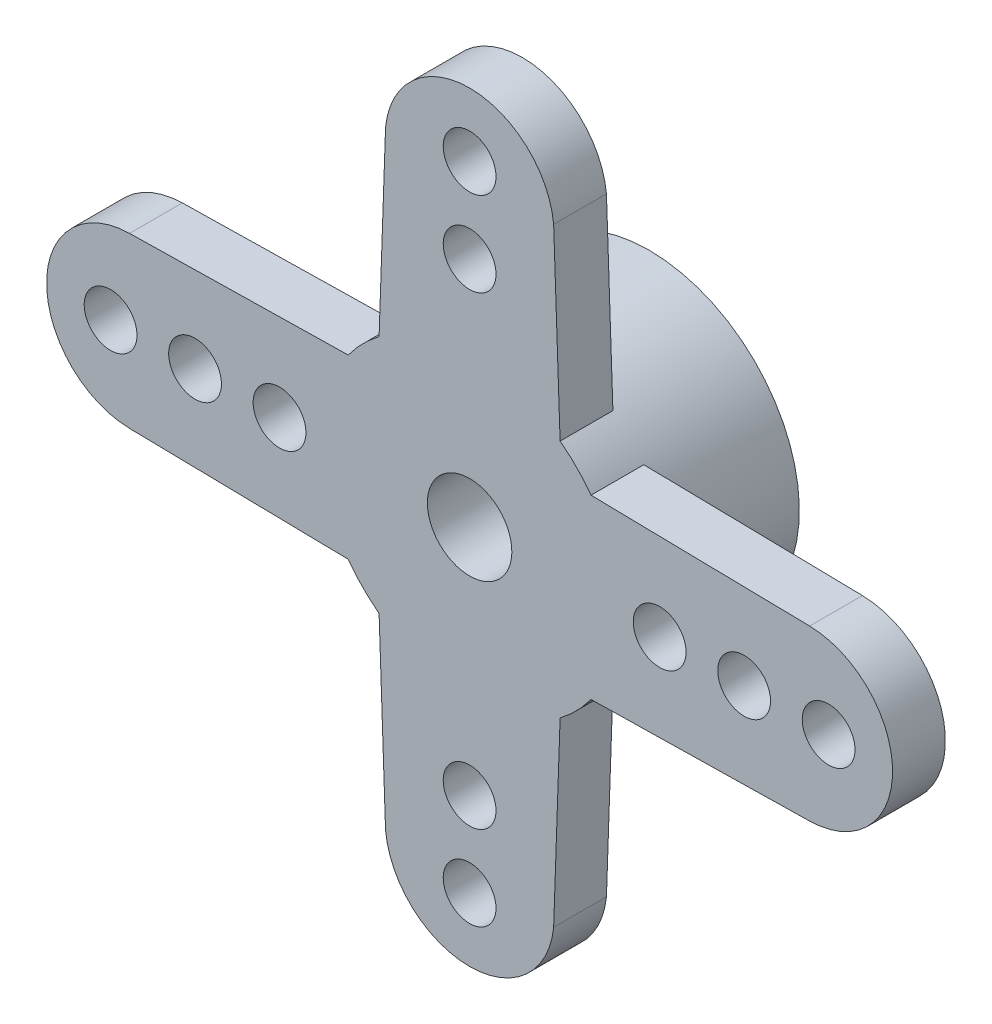
ISO-10303-21;
HEADER;
FILE_DESCRIPTION(('STEP AP214'),'2;1');
FILE_NAME('part.step','',(''),(''),'','','');
FILE_SCHEMA(('AUTOMOTIVE_DESIGN { 1 0 10303 214 1 1 1 1 }'));
ENDSEC;
DATA;
#1=APPLICATION_CONTEXT('core data for automotive mechanical design processes');
#2=APPLICATION_PROTOCOL_DEFINITION('international standard','automotive_design',2000,#1);
#3=PRODUCT_CONTEXT('',#1,'mechanical');
#4=PRODUCT('Part','Part','',(#3));
#5=PRODUCT_RELATED_PRODUCT_CATEGORY('part','',(#4));
#6=PRODUCT_DEFINITION_FORMATION('','',#4);
#7=PRODUCT_DEFINITION_CONTEXT('part definition',#1,'design');
#8=PRODUCT_DEFINITION('design','',#6,#7);
#9=PRODUCT_DEFINITION_SHAPE('','',#8);
#10=(LENGTH_UNIT() NAMED_UNIT(*) SI_UNIT(.MILLI.,.METRE.));
#11=(NAMED_UNIT(*) PLANE_ANGLE_UNIT() SI_UNIT($,.RADIAN.));
#12=(NAMED_UNIT(*) SI_UNIT($,.STERADIAN.) SOLID_ANGLE_UNIT());
#13=UNCERTAINTY_MEASURE_WITH_UNIT(LENGTH_MEASURE(1.E-05),#10,'distance_accuracy_value','');
#14=(GEOMETRIC_REPRESENTATION_CONTEXT(3) GLOBAL_UNCERTAINTY_ASSIGNED_CONTEXT((#13)) GLOBAL_UNIT_ASSIGNED_CONTEXT((#10,
#11,#12)) REPRESENTATION_CONTEXT('',''));
#15=CARTESIAN_POINT('',(0.,0.,0.));
#16=DIRECTION('',(0.,0.,1.));
#17=DIRECTION('',(1.,0.,0.));
#18=AXIS2_PLACEMENT_3D('',#15,#16,#17);
#19=CARTESIAN_POINT('',(0.,0.,24.596));
#20=DIRECTION('',(0.,0.,1.));
#21=DIRECTION('',(1.,0.,0.));
#22=AXIS2_PLACEMENT_3D('',#19,#20,#21);
#23=PLANE('',#22);
#24=CARTESIAN_POINT('',(0.,0.,24.596));
#25=DIRECTION('',(0.,0.,-1.));
#26=DIRECTION('',(0.,-1.,0.));
#27=AXIS2_PLACEMENT_3D('',#24,#25,#26);
#28=CIRCLE('',#27,1.);
#29=CARTESIAN_POINT('',(0.,1.,24.596));
#30=VERTEX_POINT('',#29);
#31=EDGE_CURVE('E393',#30,#30,#28,.T.);
#32=ORIENTED_EDGE('',*,*,#31,.F.);
#33=EDGE_LOOP('',(#32));
#34=FACE_BOUND('',#33,.T.);
#35=CARTESIAN_POINT('',(0.,0.,24.596));
#36=DIRECTION('',(0.,0.,1.));
#37=DIRECTION('',(0.,-1.,0.));
#38=AXIS2_PLACEMENT_3D('',#35,#36,#37);
#39=CIRCLE('',#38,3.55627483864503);
#40=CARTESIAN_POINT('',(0.,3.55627483864503,24.596));
#41=VERTEX_POINT('',#40);
#42=EDGE_CURVE('E11',#41,#41,#39,.T.);
#43=ORIENTED_EDGE('',*,*,#42,.F.);
#44=EDGE_LOOP('',(#43));
#45=FACE_BOUND('',#44,.T.);
#46=ADVANCED_FACE('F19',(#34,#45),#23,.F.);
#47=CARTESIAN_POINT('',(0.,0.,24.596));
#48=DIRECTION('',(0.,0.,1.));
#49=DIRECTION('',(0.,-1.,0.));
#50=AXIS2_PLACEMENT_3D('',#47,#48,#49);
#51=CYLINDRICAL_SURFACE('',#50,3.55627483864503);
#52=CARTESIAN_POINT('',(0.,0.,27.596));
#53=DIRECTION('',(0.,0.,1.));
#54=DIRECTION('',(0.,-1.,0.));
#55=AXIS2_PLACEMENT_3D('',#52,#53,#54);
#56=CIRCLE('',#55,3.55627483864503);
#57=CARTESIAN_POINT('',(2.14292282721414,2.83812834180985,27.596));
#58=VERTEX_POINT('',#57);
#59=CARTESIAN_POINT('',(0.,3.55627483864503,27.596));
#60=VERTEX_POINT('',#59);
#61=EDGE_CURVE('E413',#58,#60,#56,.T.);
#62=ORIENTED_EDGE('',*,*,#61,.F.);
#63=DIRECTION('',(0.,0.,1.));
#64=VECTOR('',#63,1.);
#65=CARTESIAN_POINT('',(2.14292282721414,2.83812834180985,27.596));
#66=LINE('',#65,#64);
#67=CARTESIAN_POINT('',(2.14292282721414,2.83812834180985,28.846));
#68=VERTEX_POINT('',#67);
#69=EDGE_CURVE('E338',#58,#68,#66,.T.);
#70=ORIENTED_EDGE('',*,*,#69,.T.);
#71=CARTESIAN_POINT('',(0.,0.,28.846));
#72=DIRECTION('',(0.,0.,1.));
#73=DIRECTION('',(0.,1.,0.));
#74=AXIS2_PLACEMENT_3D('',#71,#72,#73);
#75=CIRCLE('',#74,3.55627483864503);
#76=CARTESIAN_POINT('',(2.87430140217952,2.09415428691599,28.846));
#77=VERTEX_POINT('',#76);
#78=EDGE_CURVE('E285',#77,#68,#75,.T.);
#79=ORIENTED_EDGE('',*,*,#78,.F.);
#80=DIRECTION('',(0.,0.,1.));
#81=VECTOR('',#80,1.);
#82=CARTESIAN_POINT('',(2.87430140217952,2.09415428691599,27.596));
#83=LINE('',#82,#81);
#84=CARTESIAN_POINT('',(2.87430140217952,2.09415428691599,27.596));
#85=VERTEX_POINT('',#84);
#86=EDGE_CURVE('E333',#85,#77,#83,.T.);
#87=ORIENTED_EDGE('',*,*,#86,.F.);
#88=CARTESIAN_POINT('',(0.,0.,27.596));
#89=DIRECTION('',(0.,0.,1.));
#90=DIRECTION('',(0.,-1.,0.));
#91=AXIS2_PLACEMENT_3D('',#88,#89,#90);
#92=CIRCLE('',#91,3.55627483864503);
#93=CARTESIAN_POINT('',(2.87430140217952,-2.09415428691599,27.596));
#94=VERTEX_POINT('',#93);
#95=EDGE_CURVE('E303',#94,#85,#92,.T.);
#96=ORIENTED_EDGE('',*,*,#95,.F.);
#97=DIRECTION('',(0.,0.,1.));
#98=VECTOR('',#97,1.);
#99=CARTESIAN_POINT('',(2.87430140217952,-2.09415428691599,27.596));
#100=LINE('',#99,#98);
#101=CARTESIAN_POINT('',(2.87430140217952,-2.09415428691599,28.846));
#102=VERTEX_POINT('',#101);
#103=EDGE_CURVE('E531',#94,#102,#100,.T.);
#104=ORIENTED_EDGE('',*,*,#103,.T.);
#105=CARTESIAN_POINT('',(0.,0.,28.846));
#106=DIRECTION('',(0.,0.,1.));
#107=DIRECTION('',(0.,1.,0.));
#108=AXIS2_PLACEMENT_3D('',#105,#106,#107);
#109=CIRCLE('',#108,3.55627483864503);
#110=CARTESIAN_POINT('',(2.14292282721414,-2.83812834180985,28.846));
#111=VERTEX_POINT('',#110);
#112=EDGE_CURVE('E385',#111,#102,#109,.T.);
#113=ORIENTED_EDGE('',*,*,#112,.F.);
#114=DIRECTION('',(0.,0.,1.));
#115=VECTOR('',#114,1.);
#116=CARTESIAN_POINT('',(2.14292282721414,-2.83812834180985,27.596));
#117=LINE('',#116,#115);
#118=CARTESIAN_POINT('',(2.14292282721414,-2.83812834180985,27.596));
#119=VERTEX_POINT('',#118);
#120=EDGE_CURVE('E321',#119,#111,#117,.T.);
#121=ORIENTED_EDGE('',*,*,#120,.F.);
#122=CARTESIAN_POINT('',(0.,0.,27.596));
#123=DIRECTION('',(0.,0.,1.));
#124=DIRECTION('',(0.,-1.,0.));
#125=AXIS2_PLACEMENT_3D('',#122,#123,#124);
#126=CIRCLE('',#125,3.55627483864503);
#127=CARTESIAN_POINT('',(-2.14292282721414,-2.83812834180985,27.596));
#128=VERTEX_POINT('',#127);
#129=EDGE_CURVE('E304',#128,#119,#126,.T.);
#130=ORIENTED_EDGE('',*,*,#129,.F.);
#131=DIRECTION('',(0.,0.,1.));
#132=VECTOR('',#131,1.);
#133=CARTESIAN_POINT('',(-2.14292282721414,-2.83812834180985,27.596));
#134=LINE('',#133,#132);
#135=CARTESIAN_POINT('',(-2.14292282721414,-2.83812834180985,28.846));
#136=VERTEX_POINT('',#135);
#137=EDGE_CURVE('E465',#128,#136,#134,.T.);
#138=ORIENTED_EDGE('',*,*,#137,.T.);
#139=CARTESIAN_POINT('',(0.,0.,28.846));
#140=DIRECTION('',(0.,0.,1.));
#141=DIRECTION('',(0.,1.,0.));
#142=AXIS2_PLACEMENT_3D('',#139,#140,#141);
#143=CIRCLE('',#142,3.55627483864503);
#144=CARTESIAN_POINT('',(-2.87430140217952,-2.09415428691599,28.846));
#145=VERTEX_POINT('',#144);
#146=EDGE_CURVE('E251',#145,#136,#143,.T.);
#147=ORIENTED_EDGE('',*,*,#146,.F.);
#148=DIRECTION('',(0.,0.,1.));
#149=VECTOR('',#148,1.);
#150=CARTESIAN_POINT('',(-2.87430140217952,-2.09415428691599,27.596));
#151=LINE('',#150,#149);
#152=CARTESIAN_POINT('',(-2.87430140217952,-2.09415428691599,27.596));
#153=VERTEX_POINT('',#152);
#154=EDGE_CURVE('E342',#153,#145,#151,.T.);
#155=ORIENTED_EDGE('',*,*,#154,.F.);
#156=CARTESIAN_POINT('',(0.,0.,27.596));
#157=DIRECTION('',(0.,0.,1.));
#158=DIRECTION('',(0.,-1.,0.));
#159=AXIS2_PLACEMENT_3D('',#156,#157,#158);
#160=CIRCLE('',#159,3.55627483864503);
#161=CARTESIAN_POINT('',(-2.87430140217952,2.09415428691599,27.596));
#162=VERTEX_POINT('',#161);
#163=EDGE_CURVE('E258',#162,#153,#160,.T.);
#164=ORIENTED_EDGE('',*,*,#163,.F.);
#165=DIRECTION('',(0.,0.,1.));
#166=VECTOR('',#165,1.);
#167=CARTESIAN_POINT('',(-2.87430140217952,2.09415428691599,27.596));
#168=LINE('',#167,#166);
#169=CARTESIAN_POINT('',(-2.87430140217952,2.09415428691599,28.846));
#170=VERTEX_POINT('',#169);
#171=EDGE_CURVE('E254',#162,#170,#168,.T.);
#172=ORIENTED_EDGE('',*,*,#171,.T.);
#173=CARTESIAN_POINT('',(0.,0.,28.846));
#174=DIRECTION('',(0.,0.,1.));
#175=DIRECTION('',(0.,1.,0.));
#176=AXIS2_PLACEMENT_3D('',#173,#174,#175);
#177=CIRCLE('',#176,3.55627483864503);
#178=CARTESIAN_POINT('',(-2.14292282721414,2.83812834180985,28.846));
#179=VERTEX_POINT('',#178);
#180=EDGE_CURVE('E241',#179,#170,#177,.T.);
#181=ORIENTED_EDGE('',*,*,#180,.F.);
#182=DIRECTION('',(0.,0.,1.));
#183=VECTOR('',#182,1.);
#184=CARTESIAN_POINT('',(-2.14292282721414,2.83812834180985,27.596));
#185=LINE('',#184,#183);
#186=CARTESIAN_POINT('',(-2.14292282721414,2.83812834180985,27.596));
#187=VERTEX_POINT('',#186);
#188=EDGE_CURVE('E263',#187,#179,#185,.T.);
#189=ORIENTED_EDGE('',*,*,#188,.F.);
#190=CARTESIAN_POINT('',(0.,0.,27.596));
#191=DIRECTION('',(0.,0.,1.));
#192=DIRECTION('',(0.,-1.,0.));
#193=AXIS2_PLACEMENT_3D('',#190,#191,#192);
#194=CIRCLE('',#193,3.55627483864503);
#195=EDGE_CURVE('E23',#60,#187,#194,.T.);
#196=ORIENTED_EDGE('',*,*,#195,.F.);
#197=DIRECTION('',(0.,0.,-1.));
#198=VECTOR('',#197,1.);
#199=CARTESIAN_POINT('',(0.,3.55627483864503,24.596));
#200=LINE('',#199,#198);
#201=EDGE_CURVE('E30',#60,#41,#200,.T.);
#202=ORIENTED_EDGE('',*,*,#201,.T.);
#203=ORIENTED_EDGE('',*,*,#42,.T.);
#204=ORIENTED_EDGE('',*,*,#201,.F.);
#205=EDGE_LOOP('',(#62,#70,#79,#87,#96,#104,#113,#121,#130,#138,#147,#155,#164,#172,#181,#189,
#196,#202,#203,#204));
#206=FACE_BOUND('',#205,.T.);
#207=ADVANCED_FACE('F256',(#206),#51,.T.);
#208=CARTESIAN_POINT('',(0.,0.,24.596));
#209=DIRECTION('',(0.,0.,1.));
#210=DIRECTION('',(0.,-1.,0.));
#211=AXIS2_PLACEMENT_3D('',#208,#209,#210);
#212=CYLINDRICAL_SURFACE('',#211,1.);
#213=CARTESIAN_POINT('',(0.,0.,28.846));
#214=DIRECTION('',(0.,0.,-1.));
#215=DIRECTION('',(0.,1.,0.));
#216=AXIS2_PLACEMENT_3D('',#213,#214,#215);
#217=CIRCLE('',#216,1.);
#218=CARTESIAN_POINT('',(0.,1.,28.846));
#219=VERTEX_POINT('',#218);
#220=EDGE_CURVE('E280',#219,#219,#217,.T.);
#221=ORIENTED_EDGE('',*,*,#220,.F.);
#222=DIRECTION('',(0.,0.,-1.));
#223=VECTOR('',#222,1.);
#224=CARTESIAN_POINT('',(0.,1.,24.596));
#225=LINE('',#224,#223);
#226=EDGE_CURVE('E284',#219,#30,#225,.T.);
#227=ORIENTED_EDGE('',*,*,#226,.T.);
#228=ORIENTED_EDGE('',*,*,#31,.T.);
#229=ORIENTED_EDGE('',*,*,#226,.F.);
#230=EDGE_LOOP('',(#221,#227,#228,#229));
#231=FACE_BOUND('',#230,.T.);
#232=ADVANCED_FACE('F636',(#231),#212,.F.);
#233=CARTESIAN_POINT('',(0.,0.,28.846));
#234=DIRECTION('',(0.,0.,1.));
#235=DIRECTION('',(1.,0.,0.));
#236=AXIS2_PLACEMENT_3D('',#233,#234,#235);
#237=PLANE('',#236);
#238=CARTESIAN_POINT('',(6.5,0.,28.846));
#239=DIRECTION('',(0.,0.,-1.));
#240=DIRECTION('',(0.,1.,0.));
#241=AXIS2_PLACEMENT_3D('',#238,#239,#240);
#242=CIRCLE('',#241,0.625);
#243=CARTESIAN_POINT('',(6.5,-0.625,28.846));
#244=VERTEX_POINT('',#243);
#245=EDGE_CURVE('E477',#244,#244,#242,.T.);
#246=ORIENTED_EDGE('',*,*,#245,.T.);
#247=EDGE_LOOP('',(#246));
#248=FACE_BOUND('',#247,.T.);
#249=CARTESIAN_POINT('',(0.,5.5,28.846));
#250=DIRECTION('',(0.,0.,-1.));
#251=DIRECTION('',(0.,1.,0.));
#252=AXIS2_PLACEMENT_3D('',#249,#250,#251);
#253=CIRCLE('',#252,0.625);
#254=CARTESIAN_POINT('',(0.,4.875,28.846));
#255=VERTEX_POINT('',#254);
#256=EDGE_CURVE('E406',#255,#255,#253,.T.);
#257=ORIENTED_EDGE('',*,*,#256,.T.);
#258=EDGE_LOOP('',(#257));
#259=FACE_BOUND('',#258,.T.);
#260=CARTESIAN_POINT('',(0.,7.5,28.846));
#261=DIRECTION('',(0.,0.,-1.));
#262=DIRECTION('',(0.,1.,0.));
#263=AXIS2_PLACEMENT_3D('',#260,#261,#262);
#264=CIRCLE('',#263,0.625);
#265=CARTESIAN_POINT('',(0.,6.875,28.846));
#266=VERTEX_POINT('',#265);
#267=EDGE_CURVE('E379',#266,#266,#264,.T.);
#268=ORIENTED_EDGE('',*,*,#267,.T.);
#269=EDGE_LOOP('',(#268));
#270=FACE_BOUND('',#269,.T.);
#271=CARTESIAN_POINT('',(-4.5,0.,28.846));
#272=DIRECTION('',(0.,0.,-1.));
#273=DIRECTION('',(0.,1.,0.));
#274=AXIS2_PLACEMENT_3D('',#271,#272,#273);
#275=CIRCLE('',#274,0.625);
#276=CARTESIAN_POINT('',(-4.5,-0.625,28.846));
#277=VERTEX_POINT('',#276);
#278=EDGE_CURVE('E378',#277,#277,#275,.T.);
#279=ORIENTED_EDGE('',*,*,#278,.T.);
#280=EDGE_LOOP('',(#279));
#281=FACE_BOUND('',#280,.T.);
#282=CARTESIAN_POINT('',(4.5,0.,28.846));
#283=DIRECTION('',(0.,0.,-1.));
#284=DIRECTION('',(0.,1.,0.));
#285=AXIS2_PLACEMENT_3D('',#282,#283,#284);
#286=CIRCLE('',#285,0.625);
#287=CARTESIAN_POINT('',(4.5,-0.625,28.846));
#288=VERTEX_POINT('',#287);
#289=EDGE_CURVE('E459',#288,#288,#286,.T.);
#290=ORIENTED_EDGE('',*,*,#289,.T.);
#291=EDGE_LOOP('',(#290));
#292=FACE_BOUND('',#291,.T.);
#293=CARTESIAN_POINT('',(8.5,0.,28.846));
#294=DIRECTION('',(0.,0.,-1.));
#295=DIRECTION('',(0.,1.,0.));
#296=AXIS2_PLACEMENT_3D('',#293,#294,#295);
#297=CIRCLE('',#296,0.625);
#298=CARTESIAN_POINT('',(8.5,-0.625,28.846));
#299=VERTEX_POINT('',#298);
#300=EDGE_CURVE('E424',#299,#299,#297,.T.);
#301=ORIENTED_EDGE('',*,*,#300,.T.);
#302=EDGE_LOOP('',(#301));
#303=FACE_BOUND('',#302,.T.);
#304=CARTESIAN_POINT('',(0.,-5.5,28.846));
#305=DIRECTION('',(0.,0.,-1.));
#306=DIRECTION('',(0.,1.,0.));
#307=AXIS2_PLACEMENT_3D('',#304,#305,#306);
#308=CIRCLE('',#307,0.625);
#309=CARTESIAN_POINT('',(0.,-6.125,28.846));
#310=VERTEX_POINT('',#309);
#311=EDGE_CURVE('E380',#310,#310,#308,.T.);
#312=ORIENTED_EDGE('',*,*,#311,.T.);
#313=EDGE_LOOP('',(#312));
#314=FACE_BOUND('',#313,.T.);
#315=CARTESIAN_POINT('',(-6.5,0.,28.846));
#316=DIRECTION('',(0.,0.,-1.));
#317=DIRECTION('',(0.,1.,0.));
#318=AXIS2_PLACEMENT_3D('',#315,#316,#317);
#319=CIRCLE('',#318,0.625);
#320=CARTESIAN_POINT('',(-6.5,-0.625,28.846));
#321=VERTEX_POINT('',#320);
#322=EDGE_CURVE('E364',#321,#321,#319,.T.);
#323=ORIENTED_EDGE('',*,*,#322,.T.);
#324=EDGE_LOOP('',(#323));
#325=FACE_BOUND('',#324,.T.);
#326=CARTESIAN_POINT('',(0.,-7.5,28.846));
#327=DIRECTION('',(0.,0.,-1.));
#328=DIRECTION('',(0.,1.,0.));
#329=AXIS2_PLACEMENT_3D('',#326,#327,#328);
#330=CIRCLE('',#329,0.625);
#331=CARTESIAN_POINT('',(0.,-8.125,28.846));
#332=VERTEX_POINT('',#331);
#333=EDGE_CURVE('E343',#332,#332,#330,.T.);
#334=ORIENTED_EDGE('',*,*,#333,.T.);
#335=EDGE_LOOP('',(#334));
#336=FACE_BOUND('',#335,.T.);
#337=ORIENTED_EDGE('',*,*,#220,.T.);
#338=EDGE_LOOP('',(#337));
#339=FACE_BOUND('',#338,.T.);
#340=CARTESIAN_POINT('',(-8.5,0.,28.846));
#341=DIRECTION('',(0.,0.,-1.));
#342=DIRECTION('',(0.,1.,0.));
#343=AXIS2_PLACEMENT_3D('',#340,#341,#342);
#344=CIRCLE('',#343,0.625);
#345=CARTESIAN_POINT('',(-8.5,-0.625,28.846));
#346=VERTEX_POINT('',#345);
#347=EDGE_CURVE('E315',#346,#346,#344,.T.);
#348=ORIENTED_EDGE('',*,*,#347,.T.);
#349=EDGE_LOOP('',(#348));
#350=FACE_BOUND('',#349,.T.);
#351=DIRECTION('',(-0.0349866263033822,-0.999387780583647,0.));
#352=VECTOR('',#351,1.);
#353=CARTESIAN_POINT('',(-1.98997962611515,7.20692815052137,28.846));
#354=LINE('',#353,#352);
#355=CARTESIAN_POINT('',(-1.98997962611515,7.20692815052137,28.846));
#356=VERTEX_POINT('',#355);
#357=EDGE_CURVE('E248',#356,#179,#354,.T.);
#358=ORIENTED_EDGE('',*,*,#357,.T.);
#359=ORIENTED_EDGE('',*,*,#180,.T.);
#360=DIRECTION('',(-0.999833462443695,-0.0182495856898571,0.));
#361=VECTOR('',#360,1.);
#362=CARTESIAN_POINT('',(-8.05094639235769,1.99966692488739,28.846));
#363=LINE('',#362,#361);
#364=CARTESIAN_POINT('',(-8.05094639235769,1.99966692488739,28.846));
#365=VERTEX_POINT('',#364);
#366=EDGE_CURVE('E245',#170,#365,#363,.T.);
#367=ORIENTED_EDGE('',*,*,#366,.T.);
#368=CARTESIAN_POINT('',(-8.01444722097798,0.,28.846));
#369=DIRECTION('',(0.,0.,1.));
#370=DIRECTION('',(0.,1.,0.));
#371=AXIS2_PLACEMENT_3D('',#368,#369,#370);
#372=CIRCLE('',#371,2.);
#373=CARTESIAN_POINT('',(-8.05094639235769,-1.99966692488739,28.846));
#374=VERTEX_POINT('',#373);
#375=EDGE_CURVE('E274',#365,#374,#372,.T.);
#376=ORIENTED_EDGE('',*,*,#375,.T.);
#377=DIRECTION('',(0.999833462443695,-0.0182495856898576,0.));
#378=VECTOR('',#377,1.);
#379=CARTESIAN_POINT('',(-8.05094639235769,-1.99966692488739,28.846));
#380=LINE('',#379,#378);
#381=EDGE_CURVE('E331',#374,#145,#380,.T.);
#382=ORIENTED_EDGE('',*,*,#381,.T.);
#383=ORIENTED_EDGE('',*,*,#146,.T.);
#384=DIRECTION('',(0.0349866263033817,-0.999387780583647,0.));
#385=VECTOR('',#384,1.);
#386=CARTESIAN_POINT('',(-1.98997962611515,-7.20692815052137,28.846));
#387=LINE('',#386,#385);
#388=CARTESIAN_POINT('',(-1.98997962611516,-7.20692815052137,28.846));
#389=VERTEX_POINT('',#388);
#390=EDGE_CURVE('E278',#136,#389,#387,.T.);
#391=ORIENTED_EDGE('',*,*,#390,.T.);
#392=CARTESIAN_POINT('',(0.,-7.00697543699491,28.846));
#393=DIRECTION('',(0.,0.,1.));
#394=DIRECTION('',(0.,1.,0.));
#395=AXIS2_PLACEMENT_3D('',#392,#393,#394);
#396=CIRCLE('',#395,2.);
#397=CARTESIAN_POINT('',(1.98997962611515,-7.20692815052137,28.846));
#398=VERTEX_POINT('',#397);
#399=EDGE_CURVE('E428',#389,#398,#396,.T.);
#400=ORIENTED_EDGE('',*,*,#399,.T.);
#401=DIRECTION('',(0.0349866263033821,0.999387780583647,0.));
#402=VECTOR('',#401,1.);
#403=CARTESIAN_POINT('',(1.98997962611515,-7.20692815052137,28.846));
#404=LINE('',#403,#402);
#405=EDGE_CURVE('E316',#398,#111,#404,.T.);
#406=ORIENTED_EDGE('',*,*,#405,.T.);
#407=ORIENTED_EDGE('',*,*,#112,.T.);
#408=DIRECTION('',(0.999833462443695,0.018249585689857,0.));
#409=VECTOR('',#408,1.);
#410=CARTESIAN_POINT('',(8.05094639235769,-1.99966692488739,28.846));
#411=LINE('',#410,#409);
#412=CARTESIAN_POINT('',(8.05094639235769,-1.99966692488739,28.846));
#413=VERTEX_POINT('',#412);
#414=EDGE_CURVE('E326',#102,#413,#411,.T.);
#415=ORIENTED_EDGE('',*,*,#414,.T.);
#416=CARTESIAN_POINT('',(8.01444722097798,0.,28.846));
#417=DIRECTION('',(0.,0.,1.));
#418=DIRECTION('',(0.,1.,0.));
#419=AXIS2_PLACEMENT_3D('',#416,#417,#418);
#420=CIRCLE('',#419,2.);
#421=CARTESIAN_POINT('',(8.05094639235769,1.99966692488739,28.846));
#422=VERTEX_POINT('',#421);
#423=EDGE_CURVE('E327',#413,#422,#420,.T.);
#424=ORIENTED_EDGE('',*,*,#423,.T.);
#425=DIRECTION('',(-0.999833462443695,0.0182495856898577,0.));
#426=VECTOR('',#425,1.);
#427=CARTESIAN_POINT('',(8.05094639235769,1.99966692488739,28.846));
#428=LINE('',#427,#426);
#429=EDGE_CURVE('E337',#422,#77,#428,.T.);
#430=ORIENTED_EDGE('',*,*,#429,.T.);
#431=ORIENTED_EDGE('',*,*,#78,.T.);
#432=DIRECTION('',(-0.0349866263033815,0.999387780583647,0.));
#433=VECTOR('',#432,1.);
#434=CARTESIAN_POINT('',(1.98997962611516,7.20692815052137,28.846));
#435=LINE('',#434,#433);
#436=CARTESIAN_POINT('',(1.98997962611516,7.20692815052137,28.846));
#437=VERTEX_POINT('',#436);
#438=EDGE_CURVE('E356',#68,#437,#435,.T.);
#439=ORIENTED_EDGE('',*,*,#438,.T.);
#440=CARTESIAN_POINT('',(0.,7.00697543699491,28.846));
#441=DIRECTION('',(0.,0.,1.));
#442=DIRECTION('',(0.,1.,0.));
#443=AXIS2_PLACEMENT_3D('',#440,#441,#442);
#444=CIRCLE('',#443,2.);
#445=EDGE_CURVE('E357',#437,#356,#444,.T.);
#446=ORIENTED_EDGE('',*,*,#445,.T.);
#447=EDGE_LOOP('',(#358,#359,#367,#376,#382,#383,#391,#400,#406,#407,#415,#424,#430,#431,#439,#446));
#448=FACE_BOUND('',#447,.T.);
#449=ADVANCED_FACE('F243',(#248,#259,#270,#281,#292,#303,#314,#325,#336,#339,#350,#448),#237,.T.);
#450=CARTESIAN_POINT('',(-1.98997962611515,7.20692815052137,27.596));
#451=DIRECTION('',(-0.999387780583647,0.0349866263033822,0.));
#452=DIRECTION('',(0.,0.,1.));
#453=AXIS2_PLACEMENT_3D('',#450,#451,#452);
#454=PLANE('',#453);
#455=DIRECTION('',(-0.0349866263033822,-0.999387780583647,0.));
#456=VECTOR('',#455,1.);
#457=CARTESIAN_POINT('',(-1.98997962611515,7.20692815052137,27.596));
#458=LINE('',#457,#456);
#459=CARTESIAN_POINT('',(-1.98997962611515,7.20692815052137,27.596));
#460=VERTEX_POINT('',#459);
#461=EDGE_CURVE('E291',#460,#187,#458,.T.);
#462=ORIENTED_EDGE('',*,*,#461,.T.);
#463=ORIENTED_EDGE('',*,*,#188,.T.);
#464=ORIENTED_EDGE('',*,*,#357,.F.);
#465=DIRECTION('',(0.,0.,1.));
#466=VECTOR('',#465,1.);
#467=CARTESIAN_POINT('',(-1.98997962611515,7.20692815052137,27.596));
#468=LINE('',#467,#466);
#469=EDGE_CURVE('E314',#460,#356,#468,.T.);
#470=ORIENTED_EDGE('',*,*,#469,.F.);
#471=EDGE_LOOP('',(#462,#463,#464,#470));
#472=FACE_BOUND('',#471,.T.);
#473=ADVANCED_FACE('F646',(#472),#454,.T.);
#474=CARTESIAN_POINT('',(-2.87430140217952,2.09415428691599,27.596));
#475=DIRECTION('',(-0.0182495856898571,0.999833462443695,0.));
#476=DIRECTION('',(0.,0.,1.));
#477=AXIS2_PLACEMENT_3D('',#474,#475,#476);
#478=PLANE('',#477);
#479=DIRECTION('',(0.999833462443695,0.0182495856898571,0.));
#480=VECTOR('',#479,1.);
#481=CARTESIAN_POINT('',(-8.05094639235769,1.99966692488739,27.596));
#482=LINE('',#481,#480);
#483=CARTESIAN_POINT('',(-8.05094639235769,1.99966692488739,27.596));
#484=VERTEX_POINT('',#483);
#485=EDGE_CURVE('E402',#484,#162,#482,.T.);
#486=ORIENTED_EDGE('',*,*,#485,.F.);
#487=DIRECTION('',(0.,0.,1.));
#488=VECTOR('',#487,1.);
#489=CARTESIAN_POINT('',(-8.05094639235769,1.99966692488739,27.596));
#490=LINE('',#489,#488);
#491=EDGE_CURVE('E266',#484,#365,#490,.T.);
#492=ORIENTED_EDGE('',*,*,#491,.T.);
#493=ORIENTED_EDGE('',*,*,#366,.F.);
#494=ORIENTED_EDGE('',*,*,#171,.F.);
#495=EDGE_LOOP('',(#486,#492,#493,#494));
#496=FACE_BOUND('',#495,.T.);
#497=ADVANCED_FACE('F265',(#496),#478,.T.);
#498=CARTESIAN_POINT('',(-8.01444722097798,0.,27.596));
#499=DIRECTION('',(0.,0.,1.));
#500=DIRECTION('',(0.,1.,0.));
#501=AXIS2_PLACEMENT_3D('',#498,#499,#500);
#502=CYLINDRICAL_SURFACE('',#501,2.);
#503=CARTESIAN_POINT('',(-8.01444722097798,0.,27.596));
#504=DIRECTION('',(0.,0.,1.));
#505=DIRECTION('',(0.,1.,0.));
#506=AXIS2_PLACEMENT_3D('',#503,#504,#505);
#507=CIRCLE('',#506,2.);
#508=CARTESIAN_POINT('',(-8.05094639235769,-1.99966692488739,27.596));
#509=VERTEX_POINT('',#508);
#510=EDGE_CURVE('E398',#484,#509,#507,.T.);
#511=ORIENTED_EDGE('',*,*,#510,.T.);
#512=DIRECTION('',(0.,0.,1.));
#513=VECTOR('',#512,1.);
#514=CARTESIAN_POINT('',(-8.05094639235769,-1.99966692488739,27.596));
#515=LINE('',#514,#513);
#516=EDGE_CURVE('E328',#509,#374,#515,.T.);
#517=ORIENTED_EDGE('',*,*,#516,.T.);
#518=ORIENTED_EDGE('',*,*,#375,.F.);
#519=ORIENTED_EDGE('',*,*,#491,.F.);
#520=EDGE_LOOP('',(#511,#517,#518,#519));
#521=FACE_BOUND('',#520,.T.);
#522=ADVANCED_FACE('F670',(#521),#502,.T.);
#523=CARTESIAN_POINT('',(-8.05094639235769,-1.99966692488739,27.596));
#524=DIRECTION('',(-0.0182495856898576,-0.999833462443695,0.));
#525=DIRECTION('',(-0.999833462443695,0.0182495856898576,0.));
#526=AXIS2_PLACEMENT_3D('',#523,#524,#525);
#527=PLANE('',#526);
#528=DIRECTION('',(0.999833462443695,-0.0182495856898576,0.));
#529=VECTOR('',#528,1.);
#530=CARTESIAN_POINT('',(-8.05094639235769,-1.99966692488739,27.596));
#531=LINE('',#530,#529);
#532=EDGE_CURVE('E403',#509,#153,#531,.T.);
#533=ORIENTED_EDGE('',*,*,#532,.T.);
#534=ORIENTED_EDGE('',*,*,#154,.T.);
#535=ORIENTED_EDGE('',*,*,#381,.F.);
#536=ORIENTED_EDGE('',*,*,#516,.F.);
#537=EDGE_LOOP('',(#533,#534,#535,#536));
#538=FACE_BOUND('',#537,.T.);
#539=ADVANCED_FACE('F626',(#538),#527,.T.);
#540=CARTESIAN_POINT('',(-2.14292282721414,-2.83812834180985,27.596));
#541=DIRECTION('',(-0.999387780583647,-0.0349866263033817,0.));
#542=DIRECTION('',(-0.0349866263033817,0.999387780583647,0.));
#543=AXIS2_PLACEMENT_3D('',#540,#541,#542);
#544=PLANE('',#543);
#545=DIRECTION('',(-0.0349866263033817,0.999387780583647,0.));
#546=VECTOR('',#545,1.);
#547=CARTESIAN_POINT('',(-1.98997962611515,-7.20692815052137,27.596));
#548=LINE('',#547,#546);
#549=CARTESIAN_POINT('',(-1.98997962611515,-7.20692815052137,27.596));
#550=VERTEX_POINT('',#549);
#551=EDGE_CURVE('E292',#550,#128,#548,.T.);
#552=ORIENTED_EDGE('',*,*,#551,.F.);
#553=DIRECTION('',(0.,0.,1.));
#554=VECTOR('',#553,1.);
#555=CARTESIAN_POINT('',(-1.98997962611515,-7.20692815052137,27.596));
#556=LINE('',#555,#554);
#557=EDGE_CURVE('E592',#550,#389,#556,.T.);
#558=ORIENTED_EDGE('',*,*,#557,.T.);
#559=ORIENTED_EDGE('',*,*,#390,.F.);
#560=ORIENTED_EDGE('',*,*,#137,.F.);
#561=EDGE_LOOP('',(#552,#558,#559,#560));
#562=FACE_BOUND('',#561,.T.);
#563=ADVANCED_FACE('F607',(#562),#544,.T.);
#564=CARTESIAN_POINT('',(0.,-7.00697543699491,27.596));
#565=DIRECTION('',(0.,0.,1.));
#566=DIRECTION('',(0.,-1.,0.));
#567=AXIS2_PLACEMENT_3D('',#564,#565,#566);
#568=CYLINDRICAL_SURFACE('',#567,2.);
#569=CARTESIAN_POINT('',(0.,-7.00697543699491,27.596));
#570=DIRECTION('',(0.,0.,1.));
#571=DIRECTION('',(0.,1.,0.));
#572=AXIS2_PLACEMENT_3D('',#569,#570,#571);
#573=CIRCLE('',#572,2.);
#574=CARTESIAN_POINT('',(1.98997962611515,-7.20692815052137,27.596));
#575=VERTEX_POINT('',#574);
#576=EDGE_CURVE('E297',#550,#575,#573,.T.);
#577=ORIENTED_EDGE('',*,*,#576,.T.);
#578=DIRECTION('',(0.,0.,1.));
#579=VECTOR('',#578,1.);
#580=CARTESIAN_POINT('',(1.98997962611515,-7.20692815052137,27.596));
#581=LINE('',#580,#579);
#582=EDGE_CURVE('E320',#575,#398,#581,.T.);
#583=ORIENTED_EDGE('',*,*,#582,.T.);
#584=ORIENTED_EDGE('',*,*,#399,.F.);
#585=ORIENTED_EDGE('',*,*,#557,.F.);
#586=EDGE_LOOP('',(#577,#583,#584,#585));
#587=FACE_BOUND('',#586,.T.);
#588=ADVANCED_FACE('F617',(#587),#568,.T.);
#589=CARTESIAN_POINT('',(1.98997962611515,-7.20692815052137,27.596));
#590=DIRECTION('',(0.999387780583647,-0.0349866263033821,0.));
#591=DIRECTION('',(0.,0.,-1.));
#592=AXIS2_PLACEMENT_3D('',#589,#590,#591);
#593=PLANE('',#592);
#594=DIRECTION('',(0.0349866263033821,0.999387780583647,0.));
#595=VECTOR('',#594,1.);
#596=CARTESIAN_POINT('',(1.98997962611515,-7.20692815052137,27.596));
#597=LINE('',#596,#595);
#598=EDGE_CURVE('E308',#575,#119,#597,.T.);
#599=ORIENTED_EDGE('',*,*,#598,.T.);
#600=ORIENTED_EDGE('',*,*,#120,.T.);
#601=ORIENTED_EDGE('',*,*,#405,.F.);
#602=ORIENTED_EDGE('',*,*,#582,.F.);
#603=EDGE_LOOP('',(#599,#600,#601,#602));
#604=FACE_BOUND('',#603,.T.);
#605=ADVANCED_FACE('F615',(#604),#593,.T.);
#606=CARTESIAN_POINT('',(2.87430140217952,-2.09415428691599,27.596));
#607=DIRECTION('',(0.018249585689857,-0.999833462443695,0.));
#608=DIRECTION('',(0.,0.,-1.));
#609=AXIS2_PLACEMENT_3D('',#606,#607,#608);
#610=PLANE('',#609);
#611=DIRECTION('',(-0.999833462443695,-0.018249585689857,0.));
#612=VECTOR('',#611,1.);
#613=CARTESIAN_POINT('',(8.05094639235769,-1.99966692488739,27.596));
#614=LINE('',#613,#612);
#615=CARTESIAN_POINT('',(8.05094639235769,-1.99966692488739,27.596));
#616=VERTEX_POINT('',#615);
#617=EDGE_CURVE('E374',#616,#94,#614,.T.);
#618=ORIENTED_EDGE('',*,*,#617,.F.);
#619=DIRECTION('',(0.,0.,1.));
#620=VECTOR('',#619,1.);
#621=CARTESIAN_POINT('',(8.05094639235769,-1.99966692488739,27.596));
#622=LINE('',#621,#620);
#623=EDGE_CURVE('E322',#616,#413,#622,.T.);
#624=ORIENTED_EDGE('',*,*,#623,.T.);
#625=ORIENTED_EDGE('',*,*,#414,.F.);
#626=ORIENTED_EDGE('',*,*,#103,.F.);
#627=EDGE_LOOP('',(#618,#624,#625,#626));
#628=FACE_BOUND('',#627,.T.);
#629=ADVANCED_FACE('F21',(#628),#610,.T.);
#630=CARTESIAN_POINT('',(8.01444722097798,0.,27.596));
#631=DIRECTION('',(0.,0.,1.));
#632=DIRECTION('',(0.,1.,0.));
#633=AXIS2_PLACEMENT_3D('',#630,#631,#632);
#634=CYLINDRICAL_SURFACE('',#633,2.);
#635=CARTESIAN_POINT('',(8.01444722097798,0.,27.596));
#636=DIRECTION('',(0.,0.,1.));
#637=DIRECTION('',(0.,1.,0.));
#638=AXIS2_PLACEMENT_3D('',#635,#636,#637);
#639=CIRCLE('',#638,2.);
#640=CARTESIAN_POINT('',(8.05094639235769,1.99966692488739,27.596));
#641=VERTEX_POINT('',#640);
#642=EDGE_CURVE('E302',#616,#641,#639,.T.);
#643=ORIENTED_EDGE('',*,*,#642,.T.);
#644=DIRECTION('',(0.,0.,1.));
#645=VECTOR('',#644,1.);
#646=CARTESIAN_POINT('',(8.05094639235769,1.99966692488739,27.596));
#647=LINE('',#646,#645);
#648=EDGE_CURVE('E412',#641,#422,#647,.T.);
#649=ORIENTED_EDGE('',*,*,#648,.T.);
#650=ORIENTED_EDGE('',*,*,#423,.F.);
#651=ORIENTED_EDGE('',*,*,#623,.F.);
#652=EDGE_LOOP('',(#643,#649,#650,#651));
#653=FACE_BOUND('',#652,.T.);
#654=ADVANCED_FACE('F541',(#653),#634,.T.);
#655=CARTESIAN_POINT('',(8.05094639235769,1.99966692488739,27.596));
#656=DIRECTION('',(0.0182495856898577,0.999833462443695,0.));
#657=DIRECTION('',(0.,0.,-1.));
#658=AXIS2_PLACEMENT_3D('',#655,#656,#657);
#659=PLANE('',#658);
#660=DIRECTION('',(-0.999833462443695,0.0182495856898577,0.));
#661=VECTOR('',#660,1.);
#662=CARTESIAN_POINT('',(8.05094639235769,1.99966692488739,27.596));
#663=LINE('',#662,#661);
#664=EDGE_CURVE('E298',#641,#85,#663,.T.);
#665=ORIENTED_EDGE('',*,*,#664,.T.);
#666=ORIENTED_EDGE('',*,*,#86,.T.);
#667=ORIENTED_EDGE('',*,*,#429,.F.);
#668=ORIENTED_EDGE('',*,*,#648,.F.);
#669=EDGE_LOOP('',(#665,#666,#667,#668));
#670=FACE_BOUND('',#669,.T.);
#671=ADVANCED_FACE('F545',(#670),#659,.T.);
#672=CARTESIAN_POINT('',(2.14292282721414,2.83812834180985,27.596));
#673=DIRECTION('',(0.999387780583647,0.0349866263033815,0.));
#674=DIRECTION('',(0.,0.,-1.));
#675=AXIS2_PLACEMENT_3D('',#672,#673,#674);
#676=PLANE('',#675);
#677=DIRECTION('',(0.0349866263033815,-0.999387780583647,0.));
#678=VECTOR('',#677,1.);
#679=CARTESIAN_POINT('',(1.98997962611516,7.20692815052137,27.596));
#680=LINE('',#679,#678);
#681=CARTESIAN_POINT('',(1.98997962611516,7.20692815052137,27.596));
#682=VERTEX_POINT('',#681);
#683=EDGE_CURVE('E290',#682,#58,#680,.T.);
#684=ORIENTED_EDGE('',*,*,#683,.F.);
#685=DIRECTION('',(0.,0.,1.));
#686=VECTOR('',#685,1.);
#687=CARTESIAN_POINT('',(1.98997962611516,7.20692815052137,27.596));
#688=LINE('',#687,#686);
#689=EDGE_CURVE('E352',#682,#437,#688,.T.);
#690=ORIENTED_EDGE('',*,*,#689,.T.);
#691=ORIENTED_EDGE('',*,*,#438,.F.);
#692=ORIENTED_EDGE('',*,*,#69,.F.);
#693=EDGE_LOOP('',(#684,#690,#691,#692));
#694=FACE_BOUND('',#693,.T.);
#695=ADVANCED_FACE('F572',(#694),#676,.T.);
#696=CARTESIAN_POINT('',(0.,7.00697543699491,27.596));
#697=DIRECTION('',(0.,0.,1.));
#698=DIRECTION('',(0.,1.,0.));
#699=AXIS2_PLACEMENT_3D('',#696,#697,#698);
#700=CYLINDRICAL_SURFACE('',#699,2.);
#701=CARTESIAN_POINT('',(0.,7.00697543699491,27.596));
#702=DIRECTION('',(0.,0.,1.));
#703=DIRECTION('',(0.,1.,0.));
#704=AXIS2_PLACEMENT_3D('',#701,#702,#703);
#705=CIRCLE('',#704,2.);
#706=EDGE_CURVE('E286',#682,#460,#705,.T.);
#707=ORIENTED_EDGE('',*,*,#706,.T.);
#708=ORIENTED_EDGE('',*,*,#469,.T.);
#709=ORIENTED_EDGE('',*,*,#445,.F.);
#710=ORIENTED_EDGE('',*,*,#689,.F.);
#711=EDGE_LOOP('',(#707,#708,#709,#710));
#712=FACE_BOUND('',#711,.T.);
#713=ADVANCED_FACE('F654',(#712),#700,.T.);
#714=CARTESIAN_POINT('',(-8.5,0.,27.596));
#715=DIRECTION('',(0.,0.,1.));
#716=DIRECTION('',(0.,1.,0.));
#717=AXIS2_PLACEMENT_3D('',#714,#715,#716);
#718=CYLINDRICAL_SURFACE('',#717,0.625);
#719=ORIENTED_EDGE('',*,*,#347,.F.);
#720=DIRECTION('',(0.,0.,-1.));
#721=VECTOR('',#720,1.);
#722=CARTESIAN_POINT('',(-8.5,-0.625,27.596));
#723=LINE('',#722,#721);
#724=CARTESIAN_POINT('',(-8.5,-0.625,27.596));
#725=VERTEX_POINT('',#724);
#726=EDGE_CURVE('E310',#346,#725,#723,.T.);
#727=ORIENTED_EDGE('',*,*,#726,.T.);
#728=CARTESIAN_POINT('',(-8.5,0.,27.596));
#729=DIRECTION('',(0.,0.,-1.));
#730=DIRECTION('',(0.,1.,0.));
#731=AXIS2_PLACEMENT_3D('',#728,#729,#730);
#732=CIRCLE('',#731,0.625);
#733=EDGE_CURVE('E309',#725,#725,#732,.T.);
#734=ORIENTED_EDGE('',*,*,#733,.T.);
#735=ORIENTED_EDGE('',*,*,#726,.F.);
#736=EDGE_LOOP('',(#719,#727,#734,#735));
#737=FACE_BOUND('',#736,.T.);
#738=ADVANCED_FACE('F656',(#737),#718,.F.);
#739=CARTESIAN_POINT('',(0.,-7.5,27.596));
#740=DIRECTION('',(0.,0.,1.));
#741=DIRECTION('',(0.,1.,0.));
#742=AXIS2_PLACEMENT_3D('',#739,#740,#741);
#743=CYLINDRICAL_SURFACE('',#742,0.625);
#744=ORIENTED_EDGE('',*,*,#333,.F.);
#745=DIRECTION('',(0.,0.,-1.));
#746=VECTOR('',#745,1.);
#747=CARTESIAN_POINT('',(0.,-8.125,27.596));
#748=LINE('',#747,#746);
#749=CARTESIAN_POINT('',(0.,-8.125,27.596));
#750=VERTEX_POINT('',#749);
#751=EDGE_CURVE('E347',#332,#750,#748,.T.);
#752=ORIENTED_EDGE('',*,*,#751,.T.);
#753=CARTESIAN_POINT('',(0.,-7.5,27.596));
#754=DIRECTION('',(0.,0.,-1.));
#755=DIRECTION('',(0.,1.,0.));
#756=AXIS2_PLACEMENT_3D('',#753,#754,#755);
#757=CIRCLE('',#756,0.625);
#758=EDGE_CURVE('E296',#750,#750,#757,.T.);
#759=ORIENTED_EDGE('',*,*,#758,.T.);
#760=ORIENTED_EDGE('',*,*,#751,.F.);
#761=EDGE_LOOP('',(#744,#752,#759,#760));
#762=FACE_BOUND('',#761,.T.);
#763=ADVANCED_FACE('F706',(#762),#743,.F.);
#764=CARTESIAN_POINT('',(-6.5,0.,27.596));
#765=DIRECTION('',(0.,0.,1.));
#766=DIRECTION('',(0.,1.,0.));
#767=AXIS2_PLACEMENT_3D('',#764,#765,#766);
#768=CYLINDRICAL_SURFACE('',#767,0.625);
#769=ORIENTED_EDGE('',*,*,#322,.F.);
#770=DIRECTION('',(0.,0.,-1.));
#771=VECTOR('',#770,1.);
#772=CARTESIAN_POINT('',(-6.5,-0.625,27.596));
#773=LINE('',#772,#771);
#774=CARTESIAN_POINT('',(-6.5,-0.625,27.596));
#775=VERTEX_POINT('',#774);
#776=EDGE_CURVE('E348',#321,#775,#773,.T.);
#777=ORIENTED_EDGE('',*,*,#776,.T.);
#778=CARTESIAN_POINT('',(-6.5,0.,27.596));
#779=DIRECTION('',(0.,0.,-1.));
#780=DIRECTION('',(0.,1.,0.));
#781=AXIS2_PLACEMENT_3D('',#778,#779,#780);
#782=CIRCLE('',#781,0.625);
#783=EDGE_CURVE('E452',#775,#775,#782,.T.);
#784=ORIENTED_EDGE('',*,*,#783,.T.);
#785=ORIENTED_EDGE('',*,*,#776,.F.);
#786=EDGE_LOOP('',(#769,#777,#784,#785));
#787=FACE_BOUND('',#786,.T.);
#788=ADVANCED_FACE('F680',(#787),#768,.F.);
#789=CARTESIAN_POINT('',(0.,-5.5,27.596));
#790=DIRECTION('',(0.,0.,1.));
#791=DIRECTION('',(0.,1.,0.));
#792=AXIS2_PLACEMENT_3D('',#789,#790,#791);
#793=CYLINDRICAL_SURFACE('',#792,0.625);
#794=ORIENTED_EDGE('',*,*,#311,.F.);
#795=DIRECTION('',(0.,0.,-1.));
#796=VECTOR('',#795,1.);
#797=CARTESIAN_POINT('',(0.,-6.125,27.596));
#798=LINE('',#797,#796);
#799=CARTESIAN_POINT('',(0.,-6.125,27.596));
#800=VERTEX_POINT('',#799);
#801=EDGE_CURVE('E368',#310,#800,#798,.T.);
#802=ORIENTED_EDGE('',*,*,#801,.T.);
#803=CARTESIAN_POINT('',(0.,-5.5,27.596));
#804=DIRECTION('',(0.,0.,-1.));
#805=DIRECTION('',(0.,1.,0.));
#806=AXIS2_PLACEMENT_3D('',#803,#804,#805);
#807=CIRCLE('',#806,0.625);
#808=EDGE_CURVE('E420',#800,#800,#807,.T.);
#809=ORIENTED_EDGE('',*,*,#808,.T.);
#810=ORIENTED_EDGE('',*,*,#801,.F.);
#811=EDGE_LOOP('',(#794,#802,#809,#810));
#812=FACE_BOUND('',#811,.T.);
#813=ADVANCED_FACE('F677',(#812),#793,.F.);
#814=CARTESIAN_POINT('',(8.5,0.,27.596));
#815=DIRECTION('',(0.,0.,1.));
#816=DIRECTION('',(0.,1.,0.));
#817=AXIS2_PLACEMENT_3D('',#814,#815,#816);
#818=CYLINDRICAL_SURFACE('',#817,0.625);
#819=ORIENTED_EDGE('',*,*,#300,.F.);
#820=DIRECTION('',(0.,0.,-1.));
#821=VECTOR('',#820,1.);
#822=CARTESIAN_POINT('',(8.5,-0.625,27.596));
#823=LINE('',#822,#821);
#824=CARTESIAN_POINT('',(8.5,-0.625,27.596));
#825=VERTEX_POINT('',#824);
#826=EDGE_CURVE('E384',#299,#825,#823,.T.);
#827=ORIENTED_EDGE('',*,*,#826,.T.);
#828=CARTESIAN_POINT('',(8.5,0.,27.596));
#829=DIRECTION('',(0.,0.,-1.));
#830=DIRECTION('',(0.,1.,0.));
#831=AXIS2_PLACEMENT_3D('',#828,#829,#830);
#832=CIRCLE('',#831,0.625);
#833=EDGE_CURVE('E506',#825,#825,#832,.T.);
#834=ORIENTED_EDGE('',*,*,#833,.T.);
#835=ORIENTED_EDGE('',*,*,#826,.F.);
#836=EDGE_LOOP('',(#819,#827,#834,#835));
#837=FACE_BOUND('',#836,.T.);
#838=ADVANCED_FACE('F679',(#837),#818,.F.);
#839=CARTESIAN_POINT('',(4.5,0.,27.596));
#840=DIRECTION('',(0.,0.,1.));
#841=DIRECTION('',(0.,1.,0.));
#842=AXIS2_PLACEMENT_3D('',#839,#840,#841);
#843=CYLINDRICAL_SURFACE('',#842,0.625);
#844=ORIENTED_EDGE('',*,*,#289,.F.);
#845=DIRECTION('',(0.,0.,-1.));
#846=VECTOR('',#845,1.);
#847=CARTESIAN_POINT('',(4.5,-0.625,27.596));
#848=LINE('',#847,#846);
#849=CARTESIAN_POINT('',(4.5,-0.625,27.596));
#850=VERTEX_POINT('',#849);
#851=EDGE_CURVE('E443',#288,#850,#848,.T.);
#852=ORIENTED_EDGE('',*,*,#851,.T.);
#853=CARTESIAN_POINT('',(4.5,0.,27.596));
#854=DIRECTION('',(0.,0.,-1.));
#855=DIRECTION('',(0.,1.,0.));
#856=AXIS2_PLACEMENT_3D('',#853,#854,#855);
#857=CIRCLE('',#856,0.625);
#858=EDGE_CURVE('E491',#850,#850,#857,.T.);
#859=ORIENTED_EDGE('',*,*,#858,.T.);
#860=ORIENTED_EDGE('',*,*,#851,.F.);
#861=EDGE_LOOP('',(#844,#852,#859,#860));
#862=FACE_BOUND('',#861,.T.);
#863=ADVANCED_FACE('F642',(#862),#843,.F.);
#864=CARTESIAN_POINT('',(-4.5,0.,27.596));
#865=DIRECTION('',(0.,0.,1.));
#866=DIRECTION('',(0.,1.,0.));
#867=AXIS2_PLACEMENT_3D('',#864,#865,#866);
#868=CYLINDRICAL_SURFACE('',#867,0.625);
#869=ORIENTED_EDGE('',*,*,#278,.F.);
#870=DIRECTION('',(0.,0.,-1.));
#871=VECTOR('',#870,1.);
#872=CARTESIAN_POINT('',(-4.5,-0.625,27.596));
#873=LINE('',#872,#871);
#874=CARTESIAN_POINT('',(-4.5,-0.625,27.596));
#875=VERTEX_POINT('',#874);
#876=EDGE_CURVE('E456',#277,#875,#873,.T.);
#877=ORIENTED_EDGE('',*,*,#876,.T.);
#878=CARTESIAN_POINT('',(-4.5,0.,27.596));
#879=DIRECTION('',(0.,0.,-1.));
#880=DIRECTION('',(0.,1.,0.));
#881=AXIS2_PLACEMENT_3D('',#878,#879,#880);
#882=CIRCLE('',#881,0.625);
#883=EDGE_CURVE('E431',#875,#875,#882,.T.);
#884=ORIENTED_EDGE('',*,*,#883,.T.);
#885=ORIENTED_EDGE('',*,*,#876,.F.);
#886=EDGE_LOOP('',(#869,#877,#884,#885));
#887=FACE_BOUND('',#886,.T.);
#888=ADVANCED_FACE('F665',(#887),#868,.F.);
#889=CARTESIAN_POINT('',(0.,7.5,27.596));
#890=DIRECTION('',(0.,0.,1.));
#891=DIRECTION('',(0.,1.,0.));
#892=AXIS2_PLACEMENT_3D('',#889,#890,#891);
#893=CYLINDRICAL_SURFACE('',#892,0.625);
#894=ORIENTED_EDGE('',*,*,#267,.F.);
#895=DIRECTION('',(0.,0.,-1.));
#896=VECTOR('',#895,1.);
#897=CARTESIAN_POINT('',(0.,6.875,27.596));
#898=LINE('',#897,#896);
#899=CARTESIAN_POINT('',(0.,6.875,27.596));
#900=VERTEX_POINT('',#899);
#901=EDGE_CURVE('E375',#266,#900,#898,.T.);
#902=ORIENTED_EDGE('',*,*,#901,.T.);
#903=CARTESIAN_POINT('',(0.,7.5,27.596));
#904=DIRECTION('',(0.,0.,-1.));
#905=DIRECTION('',(0.,1.,0.));
#906=AXIS2_PLACEMENT_3D('',#903,#904,#905);
#907=CIRCLE('',#906,0.625);
#908=EDGE_CURVE('E439',#900,#900,#907,.T.);
#909=ORIENTED_EDGE('',*,*,#908,.T.);
#910=ORIENTED_EDGE('',*,*,#901,.F.);
#911=EDGE_LOOP('',(#894,#902,#909,#910));
#912=FACE_BOUND('',#911,.T.);
#913=ADVANCED_FACE('F668',(#912),#893,.F.);
#914=CARTESIAN_POINT('',(0.,5.5,27.596));
#915=DIRECTION('',(0.,0.,1.));
#916=DIRECTION('',(0.,1.,0.));
#917=AXIS2_PLACEMENT_3D('',#914,#915,#916);
#918=CYLINDRICAL_SURFACE('',#917,0.625);
#919=ORIENTED_EDGE('',*,*,#256,.F.);
#920=DIRECTION('',(0.,0.,-1.));
#921=VECTOR('',#920,1.);
#922=CARTESIAN_POINT('',(0.,4.875,27.596));
#923=LINE('',#922,#921);
#924=CARTESIAN_POINT('',(0.,4.875,27.596));
#925=VERTEX_POINT('',#924);
#926=EDGE_CURVE('E397',#255,#925,#923,.T.);
#927=ORIENTED_EDGE('',*,*,#926,.T.);
#928=CARTESIAN_POINT('',(0.,5.5,27.596));
#929=DIRECTION('',(0.,0.,-1.));
#930=DIRECTION('',(0.,1.,0.));
#931=AXIS2_PLACEMENT_3D('',#928,#929,#930);
#932=CIRCLE('',#931,0.625);
#933=EDGE_CURVE('E480',#925,#925,#932,.T.);
#934=ORIENTED_EDGE('',*,*,#933,.T.);
#935=ORIENTED_EDGE('',*,*,#926,.F.);
#936=EDGE_LOOP('',(#919,#927,#934,#935));
#937=FACE_BOUND('',#936,.T.);
#938=ADVANCED_FACE('F662',(#937),#918,.F.);
#939=CARTESIAN_POINT('',(6.5,0.,27.596));
#940=DIRECTION('',(0.,0.,1.));
#941=DIRECTION('',(0.,1.,0.));
#942=AXIS2_PLACEMENT_3D('',#939,#940,#941);
#943=CYLINDRICAL_SURFACE('',#942,0.625);
#944=ORIENTED_EDGE('',*,*,#245,.F.);
#945=DIRECTION('',(0.,0.,-1.));
#946=VECTOR('',#945,1.);
#947=CARTESIAN_POINT('',(6.5,-0.625,27.596));
#948=LINE('',#947,#946);
#949=CARTESIAN_POINT('',(6.5,-0.625,27.596));
#950=VERTEX_POINT('',#949);
#951=EDGE_CURVE('E474',#244,#950,#948,.T.);
#952=ORIENTED_EDGE('',*,*,#951,.T.);
#953=CARTESIAN_POINT('',(6.5,0.,27.596));
#954=DIRECTION('',(0.,0.,-1.));
#955=DIRECTION('',(0.,1.,0.));
#956=AXIS2_PLACEMENT_3D('',#953,#954,#955);
#957=CIRCLE('',#956,0.625);
#958=EDGE_CURVE('E487',#950,#950,#957,.T.);
#959=ORIENTED_EDGE('',*,*,#958,.T.);
#960=ORIENTED_EDGE('',*,*,#951,.F.);
#961=EDGE_LOOP('',(#944,#952,#959,#960));
#962=FACE_BOUND('',#961,.T.);
#963=ADVANCED_FACE('F659',(#962),#943,.F.);
#964=CARTESIAN_POINT('',(0.,0.,27.596));
#965=DIRECTION('',(0.,0.,1.));
#966=DIRECTION('',(1.,0.,0.));
#967=AXIS2_PLACEMENT_3D('',#964,#965,#966);
#968=PLANE('',#967);
#969=ORIENTED_EDGE('',*,*,#833,.F.);
#970=EDGE_LOOP('',(#969));
#971=FACE_BOUND('',#970,.T.);
#972=ORIENTED_EDGE('',*,*,#858,.F.);
#973=EDGE_LOOP('',(#972));
#974=FACE_BOUND('',#973,.T.);
#975=ORIENTED_EDGE('',*,*,#958,.F.);
#976=EDGE_LOOP('',(#975));
#977=FACE_BOUND('',#976,.T.);
#978=ORIENTED_EDGE('',*,*,#95,.T.);
#979=ORIENTED_EDGE('',*,*,#664,.F.);
#980=ORIENTED_EDGE('',*,*,#642,.F.);
#981=ORIENTED_EDGE('',*,*,#617,.T.);
#982=EDGE_LOOP('',(#978,#979,#980,#981));
#983=FACE_BOUND('',#982,.T.);
#984=ADVANCED_FACE('F661',(#971,#974,#977,#983),#968,.F.);
#985=CARTESIAN_POINT('',(0.,0.,27.596));
#986=DIRECTION('',(0.,0.,1.));
#987=DIRECTION('',(1.,0.,0.));
#988=AXIS2_PLACEMENT_3D('',#985,#986,#987);
#989=PLANE('',#988);
#990=ORIENTED_EDGE('',*,*,#808,.F.);
#991=EDGE_LOOP('',(#990));
#992=FACE_BOUND('',#991,.T.);
#993=ORIENTED_EDGE('',*,*,#758,.F.);
#994=EDGE_LOOP('',(#993));
#995=FACE_BOUND('',#994,.T.);
#996=ORIENTED_EDGE('',*,*,#129,.T.);
#997=ORIENTED_EDGE('',*,*,#598,.F.);
#998=ORIENTED_EDGE('',*,*,#576,.F.);
#999=ORIENTED_EDGE('',*,*,#551,.T.);
#1000=EDGE_LOOP('',(#996,#997,#998,#999));
#1001=FACE_BOUND('',#1000,.T.);
#1002=ADVANCED_FACE('F611',(#992,#995,#1001),#989,.F.);
#1003=CARTESIAN_POINT('',(0.,0.,27.596));
#1004=DIRECTION('',(0.,0.,1.));
#1005=DIRECTION('',(1.,0.,0.));
#1006=AXIS2_PLACEMENT_3D('',#1003,#1004,#1005);
#1007=PLANE('',#1006);
#1008=ORIENTED_EDGE('',*,*,#733,.F.);
#1009=EDGE_LOOP('',(#1008));
#1010=FACE_BOUND('',#1009,.T.);
#1011=ORIENTED_EDGE('',*,*,#783,.F.);
#1012=EDGE_LOOP('',(#1011));
#1013=FACE_BOUND('',#1012,.T.);
#1014=ORIENTED_EDGE('',*,*,#883,.F.);
#1015=EDGE_LOOP('',(#1014));
#1016=FACE_BOUND('',#1015,.T.);
#1017=ORIENTED_EDGE('',*,*,#163,.T.);
#1018=ORIENTED_EDGE('',*,*,#532,.F.);
#1019=ORIENTED_EDGE('',*,*,#510,.F.);
#1020=ORIENTED_EDGE('',*,*,#485,.T.);
#1021=EDGE_LOOP('',(#1017,#1018,#1019,#1020));
#1022=FACE_BOUND('',#1021,.T.);
#1023=ADVANCED_FACE('F650',(#1010,#1013,#1016,#1022),#1007,.F.);
#1024=CARTESIAN_POINT('',(0.,0.,27.596));
#1025=DIRECTION('',(0.,0.,1.));
#1026=DIRECTION('',(1.,0.,0.));
#1027=AXIS2_PLACEMENT_3D('',#1024,#1025,#1026);
#1028=PLANE('',#1027);
#1029=ORIENTED_EDGE('',*,*,#933,.F.);
#1030=EDGE_LOOP('',(#1029));
#1031=FACE_BOUND('',#1030,.T.);
#1032=ORIENTED_EDGE('',*,*,#908,.F.);
#1033=EDGE_LOOP('',(#1032));
#1034=FACE_BOUND('',#1033,.T.);
#1035=ORIENTED_EDGE('',*,*,#61,.T.);
#1036=ORIENTED_EDGE('',*,*,#195,.T.);
#1037=ORIENTED_EDGE('',*,*,#461,.F.);
#1038=ORIENTED_EDGE('',*,*,#706,.F.);
#1039=ORIENTED_EDGE('',*,*,#683,.T.);
#1040=EDGE_LOOP('',(#1035,#1036,#1037,#1038,#1039));
#1041=FACE_BOUND('',#1040,.T.);
#1042=ADVANCED_FACE('F568',(#1031,#1034,#1041),#1028,.F.);
#1043=CLOSED_SHELL('',(#46,#207,#232,#449,#473,#497,#522,#539,#563,#588,#605,#629,#654,#671,
#695,#713,#738,#763,#788,#813,#838,#863,#888,#913,#938,#963,#984,#1002,#1023,#1042));
#1044=MANIFOLD_SOLID_BREP('B1',#1043);
#1045=ADVANCED_BREP_SHAPE_REPRESENTATION('',(#18,#1044),#14);
#1046=SHAPE_DEFINITION_REPRESENTATION(#9,#1045);
ENDSEC;
END-ISO-10303-21;
